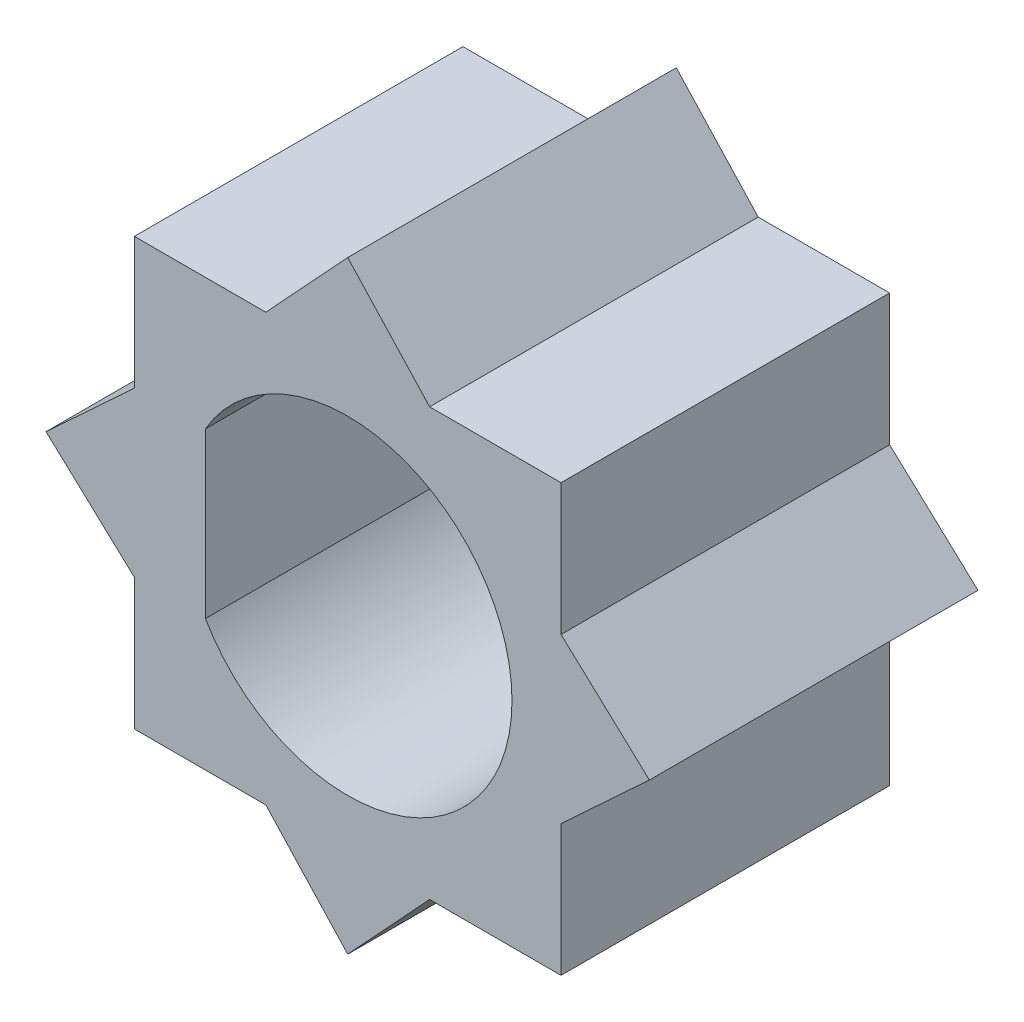
ISO-10303-21;
HEADER;
FILE_DESCRIPTION(('STEP AP214'),'2;1');
FILE_NAME('part.step','',(''),(''),'','','');
FILE_SCHEMA(('AUTOMOTIVE_DESIGN { 1 0 10303 214 1 1 1 1 }'));
ENDSEC;
DATA;
#1=APPLICATION_CONTEXT('core data for automotive mechanical design processes');
#2=APPLICATION_PROTOCOL_DEFINITION('international standard','automotive_design',2000,#1);
#3=PRODUCT_CONTEXT('',#1,'mechanical');
#4=PRODUCT('Part','Part','',(#3));
#5=PRODUCT_RELATED_PRODUCT_CATEGORY('part','',(#4));
#6=PRODUCT_DEFINITION_FORMATION('','',#4);
#7=PRODUCT_DEFINITION_CONTEXT('part definition',#1,'design');
#8=PRODUCT_DEFINITION('design','',#6,#7);
#9=PRODUCT_DEFINITION_SHAPE('','',#8);
#10=(LENGTH_UNIT() NAMED_UNIT(*) SI_UNIT(.MILLI.,.METRE.));
#11=(NAMED_UNIT(*) PLANE_ANGLE_UNIT() SI_UNIT($,.RADIAN.));
#12=(NAMED_UNIT(*) SI_UNIT($,.STERADIAN.) SOLID_ANGLE_UNIT());
#13=UNCERTAINTY_MEASURE_WITH_UNIT(LENGTH_MEASURE(1.E-05),#10,'distance_accuracy_value','');
#14=(GEOMETRIC_REPRESENTATION_CONTEXT(3) GLOBAL_UNCERTAINTY_ASSIGNED_CONTEXT((#13)) GLOBAL_UNIT_ASSIGNED_CONTEXT((#10,
#11,#12)) REPRESENTATION_CONTEXT('',''));
#15=CARTESIAN_POINT('',(0.,0.,0.));
#16=DIRECTION('',(0.,0.,1.));
#17=DIRECTION('',(1.,0.,0.));
#18=AXIS2_PLACEMENT_3D('',#15,#16,#17);
#19=CARTESIAN_POINT('',(-13.4417507259649,6.25286524946414,6.));
#20=DIRECTION('',(0.,0.,-1.));
#21=DIRECTION('',(-1.,0.,0.));
#22=AXIS2_PLACEMENT_3D('',#19,#20,#21);
#23=CYLINDRICAL_SURFACE('',#22,3.);
#24=CARTESIAN_POINT('',(-13.4417507259649,6.25286524946414,0.));
#25=DIRECTION('',(0.,0.,1.));
#26=DIRECTION('',(1.,0.,0.));
#27=AXIS2_PLACEMENT_3D('',#24,#25,#26);
#28=CIRCLE('',#27,3.);
#29=CARTESIAN_POINT('',(-16.0398269373182,4.75286524946414,0.));
#30=VERTEX_POINT('',#29);
#31=CARTESIAN_POINT('',(-16.0398269373182,7.75286524946414,0.));
#32=VERTEX_POINT('',#31);
#33=EDGE_CURVE('E189',#30,#32,#28,.T.);
#34=ORIENTED_EDGE('',*,*,#33,.F.);
#35=DIRECTION('',(0.,0.,-1.));
#36=VECTOR('',#35,1.);
#37=CARTESIAN_POINT('',(-16.0398269373182,4.75286524946414,6.));
#38=LINE('',#37,#36);
#39=CARTESIAN_POINT('',(-16.0398269373182,4.75286524946414,6.));
#40=VERTEX_POINT('',#39);
#41=EDGE_CURVE('E11',#40,#30,#38,.T.);
#42=ORIENTED_EDGE('',*,*,#41,.F.);
#43=CARTESIAN_POINT('',(-13.4417507259649,6.25286524946414,6.));
#44=DIRECTION('',(0.,0.,1.));
#45=DIRECTION('',(1.,0.,0.));
#46=AXIS2_PLACEMENT_3D('',#43,#44,#45);
#47=CIRCLE('',#46,3.);
#48=CARTESIAN_POINT('',(-16.0398269373182,7.75286524946414,6.));
#49=VERTEX_POINT('',#48);
#50=EDGE_CURVE('E172',#40,#49,#47,.T.);
#51=ORIENTED_EDGE('',*,*,#50,.T.);
#52=DIRECTION('',(0.,0.,-1.));
#53=VECTOR('',#52,1.);
#54=CARTESIAN_POINT('',(-16.0398269373182,7.75286524946414,6.));
#55=LINE('',#54,#53);
#56=EDGE_CURVE('E44',#49,#32,#55,.T.);
#57=ORIENTED_EDGE('',*,*,#56,.T.);
#58=EDGE_LOOP('',(#34,#42,#51,#57));
#59=FACE_BOUND('',#58,.T.);
#60=ADVANCED_FACE('F34',(#59),#23,.F.);
#61=CARTESIAN_POINT('',(-11.8740707010206,12.811674675176,6.));
#62=DIRECTION('',(-0.679759603640439,0.733434987751875,0.));
#63=DIRECTION('',(-0.733434987751875,-0.679759603640439,0.));
#64=AXIS2_PLACEMENT_3D('',#61,#62,#63);
#65=PLANE('',#64);
#66=DIRECTION('',(0.733434987751875,0.679759603640439,0.));
#67=VECTOR('',#66,1.);
#68=CARTESIAN_POINT('',(-11.8740707010206,12.811674675176,0.));
#69=LINE('',#68,#67);
#70=CARTESIAN_POINT('',(-18.950778827028,6.25286524946417,0.));
#71=VERTEX_POINT('',#70);
#72=CARTESIAN_POINT('',(-17.3372218539739,7.74833637747313,0.));
#73=VERTEX_POINT('',#72);
#74=EDGE_CURVE('E219',#71,#73,#69,.T.);
#75=ORIENTED_EDGE('',*,*,#74,.F.);
#76=DIRECTION('',(0.,0.,-1.));
#77=VECTOR('',#76,1.);
#78=CARTESIAN_POINT('',(-18.950778827028,6.25286524946417,6.));
#79=LINE('',#78,#77);
#80=CARTESIAN_POINT('',(-18.950778827028,6.25286524946417,6.));
#81=VERTEX_POINT('',#80);
#82=EDGE_CURVE('E38',#81,#71,#79,.T.);
#83=ORIENTED_EDGE('',*,*,#82,.F.);
#84=DIRECTION('',(0.733434987751875,0.679759603640439,0.));
#85=VECTOR('',#84,1.);
#86=CARTESIAN_POINT('',(-11.8740707010206,12.811674675176,6.));
#87=LINE('',#86,#85);
#88=CARTESIAN_POINT('',(-17.3372218539739,7.74833637747313,6.));
#89=VERTEX_POINT('',#88);
#90=EDGE_CURVE('E168',#81,#89,#87,.T.);
#91=ORIENTED_EDGE('',*,*,#90,.T.);
#92=DIRECTION('',(0.,0.,-1.));
#93=VECTOR('',#92,1.);
#94=CARTESIAN_POINT('',(-17.3372218539739,7.74833637747313,6.));
#95=LINE('',#94,#93);
#96=EDGE_CURVE('E176',#89,#73,#95,.T.);
#97=ORIENTED_EDGE('',*,*,#96,.T.);
#98=EDGE_LOOP('',(#75,#83,#91,#97));
#99=FACE_BOUND('',#98,.T.);
#100=ADVANCED_FACE('F36',(#99),#65,.T.);
#101=CARTESIAN_POINT('',(-5.63922024934631,-6.08450607002705,6.));
#102=DIRECTION('',(0.679759603640439,0.733434987751875,0.));
#103=DIRECTION('',(-0.733434987751875,0.679759603640439,0.));
#104=AXIS2_PLACEMENT_3D('',#101,#102,#103);
#105=PLANE('',#104);
#106=DIRECTION('',(0.733434987751875,-0.679759603640439,0.));
#107=VECTOR('',#106,1.);
#108=CARTESIAN_POINT('',(-5.63922024934631,-6.08450607002705,0.));
#109=LINE('',#108,#107);
#110=CARTESIAN_POINT('',(-17.3372218539739,4.7573941214552,0.));
#111=VERTEX_POINT('',#110);
#112=EDGE_CURVE('E221',#71,#111,#109,.T.);
#113=ORIENTED_EDGE('',*,*,#112,.T.);
#114=DIRECTION('',(0.,0.,-1.));
#115=VECTOR('',#114,1.);
#116=CARTESIAN_POINT('',(-17.3372218539739,4.7573941214552,6.));
#117=LINE('',#116,#115);
#118=CARTESIAN_POINT('',(-17.3372218539739,4.7573941214552,6.));
#119=VERTEX_POINT('',#118);
#120=EDGE_CURVE('E282',#119,#111,#117,.T.);
#121=ORIENTED_EDGE('',*,*,#120,.F.);
#122=DIRECTION('',(0.733434987751875,-0.679759603640439,0.));
#123=VECTOR('',#122,1.);
#124=CARTESIAN_POINT('',(-5.63922024934631,-6.08450607002705,6.));
#125=LINE('',#124,#123);
#126=EDGE_CURVE('E184',#81,#119,#125,.T.);
#127=ORIENTED_EDGE('',*,*,#126,.F.);
#128=ORIENTED_EDGE('',*,*,#82,.T.);
#129=EDGE_LOOP('',(#113,#121,#127,#128));
#130=FACE_BOUND('',#129,.T.);
#131=ADVANCED_FACE('F290',(#130),#105,.F.);
#132=CARTESIAN_POINT('',(-17.3372218539739,0.,6.));
#133=DIRECTION('',(1.,0.,0.));
#134=DIRECTION('',(0.,0.,-1.));
#135=AXIS2_PLACEMENT_3D('',#132,#133,#134);
#136=PLANE('',#135);
#137=DIRECTION('',(0.,-1.,0.));
#138=VECTOR('',#137,1.);
#139=CARTESIAN_POINT('',(-17.3372218539739,0.,0.));
#140=LINE('',#139,#138);
#141=CARTESIAN_POINT('',(-17.3372218539739,2.35739412145516,0.));
#142=VERTEX_POINT('',#141);
#143=EDGE_CURVE('E223',#111,#142,#140,.T.);
#144=ORIENTED_EDGE('',*,*,#143,.T.);
#145=DIRECTION('',(0.,0.,-1.));
#146=VECTOR('',#145,1.);
#147=CARTESIAN_POINT('',(-17.3372218539739,2.35739412145516,6.));
#148=LINE('',#147,#146);
#149=CARTESIAN_POINT('',(-17.3372218539739,2.35739412145516,6.));
#150=VERTEX_POINT('',#149);
#151=EDGE_CURVE('E280',#150,#142,#148,.T.);
#152=ORIENTED_EDGE('',*,*,#151,.F.);
#153=DIRECTION('',(0.,-1.,0.));
#154=VECTOR('',#153,1.);
#155=CARTESIAN_POINT('',(-17.3372218539739,0.,6.));
#156=LINE('',#155,#154);
#157=EDGE_CURVE('E174',#119,#150,#156,.T.);
#158=ORIENTED_EDGE('',*,*,#157,.F.);
#159=ORIENTED_EDGE('',*,*,#120,.T.);
#160=EDGE_LOOP('',(#144,#152,#158,#159));
#161=FACE_BOUND('',#160,.T.);
#162=ADVANCED_FACE('F296',(#161),#136,.F.);
#163=CARTESIAN_POINT('',(0.,2.35739412145516,6.));
#164=DIRECTION('',(0.,1.,0.));
#165=DIRECTION('',(0.,0.,1.));
#166=AXIS2_PLACEMENT_3D('',#163,#164,#165);
#167=PLANE('',#166);
#168=DIRECTION('',(1.,0.,0.));
#169=VECTOR('',#168,1.);
#170=CARTESIAN_POINT('',(0.,2.35739412145516,0.));
#171=LINE('',#170,#169);
#172=CARTESIAN_POINT('',(-14.9372218539739,2.35739412145516,0.));
#173=VERTEX_POINT('',#172);
#174=EDGE_CURVE('E225',#142,#173,#171,.T.);
#175=ORIENTED_EDGE('',*,*,#174,.T.);
#176=DIRECTION('',(0.,0.,-1.));
#177=VECTOR('',#176,1.);
#178=CARTESIAN_POINT('',(-14.9372218539739,2.35739412145516,6.));
#179=LINE('',#178,#177);
#180=CARTESIAN_POINT('',(-14.9372218539739,2.35739412145516,6.));
#181=VERTEX_POINT('',#180);
#182=EDGE_CURVE('E278',#181,#173,#179,.T.);
#183=ORIENTED_EDGE('',*,*,#182,.F.);
#184=DIRECTION('',(1.,0.,0.));
#185=VECTOR('',#184,1.);
#186=CARTESIAN_POINT('',(0.,2.35739412145516,6.));
#187=LINE('',#186,#185);
#188=EDGE_CURVE('E192',#150,#181,#187,.T.);
#189=ORIENTED_EDGE('',*,*,#188,.F.);
#190=ORIENTED_EDGE('',*,*,#151,.T.);
#191=EDGE_LOOP('',(#175,#183,#189,#190));
#192=FACE_BOUND('',#191,.T.);
#193=ADVANCED_FACE('F299',(#192),#167,.F.);
#194=CARTESIAN_POINT('',(-6.85983198731295,-6.35780505512735,6.));
#195=DIRECTION('',(-0.733434987751855,-0.679759603640461,0.));
#196=DIRECTION('',(0.679759603640461,-0.733434987751855,0.));
#197=AXIS2_PLACEMENT_3D('',#194,#195,#196);
#198=PLANE('',#197);
#199=DIRECTION('',(-0.679759603640461,0.733434987751855,0.));
#200=VECTOR('',#199,1.);
#201=CARTESIAN_POINT('',(-6.85983198731295,-6.35780505512735,0.));
#202=LINE('',#201,#200);
#203=CARTESIAN_POINT('',(-13.4417507259648,0.743837148401012,0.));
#204=VERTEX_POINT('',#203);
#205=EDGE_CURVE('E228',#204,#173,#202,.T.);
#206=ORIENTED_EDGE('',*,*,#205,.F.);
#207=DIRECTION('',(0.,0.,-1.));
#208=VECTOR('',#207,1.);
#209=CARTESIAN_POINT('',(-13.4417507259648,0.743837148401012,6.));
#210=LINE('',#209,#208);
#211=CARTESIAN_POINT('',(-13.4417507259648,0.743837148401012,6.));
#212=VERTEX_POINT('',#211);
#213=EDGE_CURVE('E276',#212,#204,#210,.T.);
#214=ORIENTED_EDGE('',*,*,#213,.F.);
#215=DIRECTION('',(-0.679759603640461,0.733434987751855,0.));
#216=VECTOR('',#215,1.);
#217=CARTESIAN_POINT('',(-6.85983198731295,-6.35780505512735,6.));
#218=LINE('',#217,#216);
#219=EDGE_CURVE('E194',#212,#181,#218,.T.);
#220=ORIENTED_EDGE('',*,*,#219,.T.);
#221=ORIENTED_EDGE('',*,*,#182,.T.);
#222=EDGE_LOOP('',(#206,#214,#220,#221));
#223=FACE_BOUND('',#222,.T.);
#224=ADVANCED_FACE('F306',(#223),#198,.T.);
#225=CARTESIAN_POINT('',(-7.60152610603424,7.04521935712204,6.));
#226=DIRECTION('',(-0.733434987751889,0.679759603640424,0.));
#227=DIRECTION('',(-0.679759603640424,-0.733434987751889,0.));
#228=AXIS2_PLACEMENT_3D('',#225,#226,#227);
#229=PLANE('',#228);
#230=DIRECTION('',(0.679759603640424,0.733434987751889,0.));
#231=VECTOR('',#230,1.);
#232=CARTESIAN_POINT('',(-7.60152610603424,7.04521935712204,0.));
#233=LINE('',#232,#231);
#234=CARTESIAN_POINT('',(-11.9462795979558,2.35739412145516,0.));
#235=VERTEX_POINT('',#234);
#236=EDGE_CURVE('E232',#204,#235,#233,.T.);
#237=ORIENTED_EDGE('',*,*,#236,.T.);
#238=DIRECTION('',(0.,0.,-1.));
#239=VECTOR('',#238,1.);
#240=CARTESIAN_POINT('',(-11.9462795979558,2.35739412145516,6.));
#241=LINE('',#240,#239);
#242=CARTESIAN_POINT('',(-11.9462795979558,2.35739412145516,6.));
#243=VERTEX_POINT('',#242);
#244=EDGE_CURVE('E273',#243,#235,#241,.T.);
#245=ORIENTED_EDGE('',*,*,#244,.F.);
#246=DIRECTION('',(0.679759603640424,0.733434987751889,0.));
#247=VECTOR('',#246,1.);
#248=CARTESIAN_POINT('',(-7.60152610603424,7.04521935712204,6.));
#249=LINE('',#248,#247);
#250=EDGE_CURVE('E198',#212,#243,#249,.T.);
#251=ORIENTED_EDGE('',*,*,#250,.F.);
#252=ORIENTED_EDGE('',*,*,#213,.T.);
#253=EDGE_LOOP('',(#237,#245,#251,#252));
#254=FACE_BOUND('',#253,.T.);
#255=ADVANCED_FACE('F309',(#254),#229,.F.);
#256=CARTESIAN_POINT('',(-9.54627959795585,2.35739412145516,0.));
#257=VERTEX_POINT('',#256);
#258=EDGE_CURVE('E229',#235,#257,#171,.T.);
#259=ORIENTED_EDGE('',*,*,#258,.T.);
#260=DIRECTION('',(0.,0.,-1.));
#261=VECTOR('',#260,1.);
#262=CARTESIAN_POINT('',(-9.54627959795585,2.35739412145516,6.));
#263=LINE('',#262,#261);
#264=CARTESIAN_POINT('',(-9.54627959795585,2.35739412145516,6.));
#265=VERTEX_POINT('',#264);
#266=EDGE_CURVE('E271',#265,#257,#263,.T.);
#267=ORIENTED_EDGE('',*,*,#266,.F.);
#268=EDGE_CURVE('E195',#243,#265,#187,.T.);
#269=ORIENTED_EDGE('',*,*,#268,.F.);
#270=ORIENTED_EDGE('',*,*,#244,.T.);
#271=EDGE_LOOP('',(#259,#267,#269,#270));
#272=FACE_BOUND('',#271,.T.);
#273=ADVANCED_FACE('F315',(#272),#167,.F.);
#274=CARTESIAN_POINT('',(-9.54627959795585,0.,6.));
#275=DIRECTION('',(1.,0.,0.));
#276=DIRECTION('',(0.,0.,-1.));
#277=AXIS2_PLACEMENT_3D('',#274,#275,#276);
#278=PLANE('',#277);
#279=DIRECTION('',(0.,-1.,0.));
#280=VECTOR('',#279,1.);
#281=CARTESIAN_POINT('',(-9.54627959795585,0.,0.));
#282=LINE('',#281,#280);
#283=CARTESIAN_POINT('',(-9.54627959795585,4.75739412145515,0.));
#284=VERTEX_POINT('',#283);
#285=EDGE_CURVE('E234',#284,#257,#282,.T.);
#286=ORIENTED_EDGE('',*,*,#285,.F.);
#287=DIRECTION('',(0.,0.,-1.));
#288=VECTOR('',#287,1.);
#289=CARTESIAN_POINT('',(-9.54627959795585,4.75739412145515,6.));
#290=LINE('',#289,#288);
#291=CARTESIAN_POINT('',(-9.54627959795585,4.75739412145515,6.));
#292=VERTEX_POINT('',#291);
#293=EDGE_CURVE('E269',#292,#284,#290,.T.);
#294=ORIENTED_EDGE('',*,*,#293,.F.);
#295=DIRECTION('',(0.,-1.,0.));
#296=VECTOR('',#295,1.);
#297=CARTESIAN_POINT('',(-9.54627959795585,0.,6.));
#298=LINE('',#297,#296);
#299=EDGE_CURVE('E200',#292,#265,#298,.T.);
#300=ORIENTED_EDGE('',*,*,#299,.T.);
#301=ORIENTED_EDGE('',*,*,#266,.T.);
#302=EDGE_LOOP('',(#286,#294,#300,#301));
#303=FACE_BOUND('',#302,.T.);
#304=ADVANCED_FACE('F322',(#303),#278,.T.);
#305=CARTESIAN_POINT('',(-6.78292310923605,7.31851834222237,6.));
#306=DIRECTION('',(-0.679759603640446,0.733434987751869,0.));
#307=DIRECTION('',(-0.733434987751869,-0.679759603640446,0.));
#308=AXIS2_PLACEMENT_3D('',#305,#306,#307);
#309=PLANE('',#308);
#310=DIRECTION('',(0.733434987751869,0.679759603640446,0.));
#311=VECTOR('',#310,1.);
#312=CARTESIAN_POINT('',(-6.78292310923605,7.31851834222237,0.));
#313=LINE('',#312,#311);
#314=CARTESIAN_POINT('',(-7.93272262490172,6.25286524946414,0.));
#315=VERTEX_POINT('',#314);
#316=EDGE_CURVE('E237',#284,#315,#313,.T.);
#317=ORIENTED_EDGE('',*,*,#316,.T.);
#318=DIRECTION('',(0.,0.,-1.));
#319=VECTOR('',#318,1.);
#320=CARTESIAN_POINT('',(-7.93272262490172,6.25286524946414,6.));
#321=LINE('',#320,#319);
#322=CARTESIAN_POINT('',(-7.93272262490172,6.25286524946414,6.));
#323=VERTEX_POINT('',#322);
#324=EDGE_CURVE('E267',#323,#315,#321,.T.);
#325=ORIENTED_EDGE('',*,*,#324,.F.);
#326=DIRECTION('',(0.733434987751869,0.679759603640446,0.));
#327=VECTOR('',#326,1.);
#328=CARTESIAN_POINT('',(-6.78292310923605,7.31851834222237,6.));
#329=LINE('',#328,#327);
#330=EDGE_CURVE('E203',#292,#323,#329,.T.);
#331=ORIENTED_EDGE('',*,*,#330,.F.);
#332=ORIENTED_EDGE('',*,*,#293,.T.);
#333=EDGE_LOOP('',(#317,#325,#331,#332));
#334=FACE_BOUND('',#333,.T.);
#335=ADVANCED_FACE('F325',(#334),#309,.F.);
#336=CARTESIAN_POINT('',(-0.548072657561674,-0.591349737073399,6.));
#337=DIRECTION('',(0.679759603640432,0.733434987751882,0.));
#338=DIRECTION('',(-0.733434987751882,0.679759603640432,0.));
#339=AXIS2_PLACEMENT_3D('',#336,#337,#338);
#340=PLANE('',#339);
#341=DIRECTION('',(0.733434987751881,-0.679759603640432,0.));
#342=VECTOR('',#341,1.);
#343=CARTESIAN_POINT('',(-0.548072657561674,-0.591349737073399,0.));
#344=LINE('',#343,#342);
#345=CARTESIAN_POINT('',(-9.54627959795585,7.74833637747307,0.));
#346=VERTEX_POINT('',#345);
#347=EDGE_CURVE('E241',#346,#315,#344,.T.);
#348=ORIENTED_EDGE('',*,*,#347,.F.);
#349=DIRECTION('',(0.,0.,-1.));
#350=VECTOR('',#349,1.);
#351=CARTESIAN_POINT('',(-9.54627959795585,7.74833637747307,6.));
#352=LINE('',#351,#350);
#353=CARTESIAN_POINT('',(-9.54627959795585,7.74833637747307,6.));
#354=VERTEX_POINT('',#353);
#355=EDGE_CURVE('E265',#354,#346,#352,.T.);
#356=ORIENTED_EDGE('',*,*,#355,.F.);
#357=DIRECTION('',(0.733434987751881,-0.679759603640432,0.));
#358=VECTOR('',#357,1.);
#359=CARTESIAN_POINT('',(-0.548072657561674,-0.591349737073399,6.));
#360=LINE('',#359,#358);
#361=EDGE_CURVE('E206',#354,#323,#360,.T.);
#362=ORIENTED_EDGE('',*,*,#361,.T.);
#363=ORIENTED_EDGE('',*,*,#324,.T.);
#364=EDGE_LOOP('',(#348,#356,#362,#363));
#365=FACE_BOUND('',#364,.T.);
#366=ADVANCED_FACE('F328',(#365),#340,.T.);
#367=CARTESIAN_POINT('',(-9.54627959795585,10.1483363774731,0.));
#368=VERTEX_POINT('',#367);
#369=EDGE_CURVE('E238',#368,#346,#282,.T.);
#370=ORIENTED_EDGE('',*,*,#369,.F.);
#371=DIRECTION('',(0.,0.,-1.));
#372=VECTOR('',#371,1.);
#373=CARTESIAN_POINT('',(-9.54627959795585,10.1483363774731,6.));
#374=LINE('',#373,#372);
#375=CARTESIAN_POINT('',(-9.54627959795585,10.1483363774731,6.));
#376=VERTEX_POINT('',#375);
#377=EDGE_CURVE('E263',#376,#368,#374,.T.);
#378=ORIENTED_EDGE('',*,*,#377,.F.);
#379=EDGE_CURVE('E204',#376,#354,#298,.T.);
#380=ORIENTED_EDGE('',*,*,#379,.T.);
#381=ORIENTED_EDGE('',*,*,#355,.T.);
#382=EDGE_LOOP('',(#370,#378,#380,#381));
#383=FACE_BOUND('',#382,.T.);
#384=ADVANCED_FACE('F334',(#383),#278,.T.);
#385=CARTESIAN_POINT('',(0.,10.1483363774731,6.));
#386=DIRECTION('',(0.,1.,0.));
#387=DIRECTION('',(0.,0.,1.));
#388=AXIS2_PLACEMENT_3D('',#385,#386,#387);
#389=PLANE('',#388);
#390=DIRECTION('',(1.,0.,0.));
#391=VECTOR('',#390,1.);
#392=CARTESIAN_POINT('',(0.,10.1483363774731,0.));
#393=LINE('',#392,#391);
#394=CARTESIAN_POINT('',(-11.9462795979558,10.1483363774731,0.));
#395=VERTEX_POINT('',#394);
#396=EDGE_CURVE('E244',#395,#368,#393,.T.);
#397=ORIENTED_EDGE('',*,*,#396,.F.);
#398=DIRECTION('',(0.,0.,-1.));
#399=VECTOR('',#398,1.);
#400=CARTESIAN_POINT('',(-11.9462795979558,10.1483363774731,6.));
#401=LINE('',#400,#399);
#402=CARTESIAN_POINT('',(-11.9462795979558,10.1483363774731,6.));
#403=VERTEX_POINT('',#402);
#404=EDGE_CURVE('E261',#403,#395,#401,.T.);
#405=ORIENTED_EDGE('',*,*,#404,.F.);
#406=DIRECTION('',(1.,0.,0.));
#407=VECTOR('',#406,1.);
#408=CARTESIAN_POINT('',(0.,10.1483363774731,6.));
#409=LINE('',#408,#407);
#410=EDGE_CURVE('E209',#403,#376,#409,.T.);
#411=ORIENTED_EDGE('',*,*,#410,.T.);
#412=ORIENTED_EDGE('',*,*,#377,.T.);
#413=EDGE_LOOP('',(#397,#405,#411,#412));
#414=FACE_BOUND('',#413,.T.);
#415=ADVANCED_FACE('F338',(#414),#389,.T.);
#416=CARTESIAN_POINT('',(-1.36667565435981,-1.26665746334282,6.));
#417=DIRECTION('',(0.733434987751876,0.679759603640438,0.));
#418=DIRECTION('',(-0.679759603640438,0.733434987751877,0.));
#419=AXIS2_PLACEMENT_3D('',#416,#417,#418);
#420=PLANE('',#419);
#421=DIRECTION('',(0.679759603640438,-0.733434987751877,0.));
#422=VECTOR('',#421,1.);
#423=CARTESIAN_POINT('',(-1.36667565435981,-1.26665746334282,0.));
#424=LINE('',#423,#422);
#425=CARTESIAN_POINT('',(-13.4417507259648,11.7618933505273,0.));
#426=VERTEX_POINT('',#425);
#427=EDGE_CURVE('E247',#426,#395,#424,.T.);
#428=ORIENTED_EDGE('',*,*,#427,.F.);
#429=DIRECTION('',(0.,0.,-1.));
#430=VECTOR('',#429,1.);
#431=CARTESIAN_POINT('',(-13.4417507259648,11.7618933505273,6.));
#432=LINE('',#431,#430);
#433=CARTESIAN_POINT('',(-13.4417507259648,11.7618933505273,6.));
#434=VERTEX_POINT('',#433);
#435=EDGE_CURVE('E259',#434,#426,#432,.T.);
#436=ORIENTED_EDGE('',*,*,#435,.F.);
#437=DIRECTION('',(0.679759603640438,-0.733434987751877,0.));
#438=VECTOR('',#437,1.);
#439=CARTESIAN_POINT('',(-1.36667565435981,-1.26665746334282,6.));
#440=LINE('',#439,#438);
#441=EDGE_CURVE('E212',#434,#403,#440,.T.);
#442=ORIENTED_EDGE('',*,*,#441,.T.);
#443=ORIENTED_EDGE('',*,*,#404,.T.);
#444=EDGE_LOOP('',(#428,#436,#442,#443));
#445=FACE_BOUND('',#444,.T.);
#446=ADVANCED_FACE('F342',(#445),#420,.T.);
#447=CARTESIAN_POINT('',(-13.0946824389881,12.1363669489062,6.));
#448=DIRECTION('',(0.733434987751901,-0.679759603640411,0.));
#449=DIRECTION('',(0.679759603640411,0.733434987751901,0.));
#450=AXIS2_PLACEMENT_3D('',#447,#448,#449);
#451=PLANE('',#450);
#452=DIRECTION('',(-0.679759603640411,-0.733434987751901,0.));
#453=VECTOR('',#452,1.);
#454=CARTESIAN_POINT('',(-13.0946824389881,12.1363669489062,0.));
#455=LINE('',#454,#453);
#456=CARTESIAN_POINT('',(-14.9372218539738,10.1483363774731,0.));
#457=VERTEX_POINT('',#456);
#458=EDGE_CURVE('E251',#426,#457,#455,.T.);
#459=ORIENTED_EDGE('',*,*,#458,.T.);
#460=DIRECTION('',(0.,0.,-1.));
#461=VECTOR('',#460,1.);
#462=CARTESIAN_POINT('',(-14.9372218539738,10.1483363774731,6.));
#463=LINE('',#462,#461);
#464=CARTESIAN_POINT('',(-14.9372218539738,10.1483363774731,6.));
#465=VERTEX_POINT('',#464);
#466=EDGE_CURVE('E257',#465,#457,#463,.T.);
#467=ORIENTED_EDGE('',*,*,#466,.F.);
#468=DIRECTION('',(-0.679759603640411,-0.733434987751901,0.));
#469=VECTOR('',#468,1.);
#470=CARTESIAN_POINT('',(-13.0946824389881,12.1363669489062,6.));
#471=LINE('',#470,#469);
#472=EDGE_CURVE('E215',#434,#465,#471,.T.);
#473=ORIENTED_EDGE('',*,*,#472,.F.);
#474=ORIENTED_EDGE('',*,*,#435,.T.);
#475=EDGE_LOOP('',(#459,#467,#473,#474));
#476=FACE_BOUND('',#475,.T.);
#477=ADVANCED_FACE('F347',(#476),#451,.F.);
#478=CARTESIAN_POINT('',(-17.3372218539739,10.1483363774731,0.));
#479=VERTEX_POINT('',#478);
#480=EDGE_CURVE('E248',#479,#457,#393,.T.);
#481=ORIENTED_EDGE('',*,*,#480,.F.);
#482=DIRECTION('',(0.,0.,-1.));
#483=VECTOR('',#482,1.);
#484=CARTESIAN_POINT('',(-17.3372218539739,10.1483363774731,6.));
#485=LINE('',#484,#483);
#486=CARTESIAN_POINT('',(-17.3372218539739,10.1483363774731,6.));
#487=VERTEX_POINT('',#486);
#488=EDGE_CURVE('E181',#487,#479,#485,.T.);
#489=ORIENTED_EDGE('',*,*,#488,.F.);
#490=EDGE_CURVE('E170',#487,#465,#409,.T.);
#491=ORIENTED_EDGE('',*,*,#490,.T.);
#492=ORIENTED_EDGE('',*,*,#466,.T.);
#493=EDGE_LOOP('',(#481,#489,#491,#492));
#494=FACE_BOUND('',#493,.T.);
#495=ADVANCED_FACE('F351',(#494),#389,.T.);
#496=EDGE_CURVE('E179',#479,#73,#140,.T.);
#497=ORIENTED_EDGE('',*,*,#496,.T.);
#498=ORIENTED_EDGE('',*,*,#96,.F.);
#499=EDGE_CURVE('E164',#487,#89,#156,.T.);
#500=ORIENTED_EDGE('',*,*,#499,.F.);
#501=ORIENTED_EDGE('',*,*,#488,.T.);
#502=EDGE_LOOP('',(#497,#498,#500,#501));
#503=FACE_BOUND('',#502,.T.);
#504=ADVANCED_FACE('F177',(#503),#136,.F.);
#505=CARTESIAN_POINT('',(-16.0398269373182,0.,6.));
#506=DIRECTION('',(1.,0.,0.));
#507=DIRECTION('',(0.,0.,-1.));
#508=AXIS2_PLACEMENT_3D('',#505,#506,#507);
#509=PLANE('',#508);
#510=DIRECTION('',(0.,-1.,0.));
#511=VECTOR('',#510,1.);
#512=CARTESIAN_POINT('',(-16.0398269373182,0.,0.));
#513=LINE('',#512,#511);
#514=EDGE_CURVE('E185',#32,#30,#513,.T.);
#515=ORIENTED_EDGE('',*,*,#514,.F.);
#516=ORIENTED_EDGE('',*,*,#56,.F.);
#517=DIRECTION('',(0.,-1.,0.));
#518=VECTOR('',#517,1.);
#519=CARTESIAN_POINT('',(-16.0398269373182,0.,6.));
#520=LINE('',#519,#518);
#521=EDGE_CURVE('E182',#49,#40,#520,.T.);
#522=ORIENTED_EDGE('',*,*,#521,.T.);
#523=ORIENTED_EDGE('',*,*,#41,.T.);
#524=EDGE_LOOP('',(#515,#516,#522,#523));
#525=FACE_BOUND('',#524,.T.);
#526=ADVANCED_FACE('F358',(#525),#509,.T.);
#527=CARTESIAN_POINT('',(0.,0.,6.));
#528=DIRECTION('',(0.,0.,1.));
#529=DIRECTION('',(1.,0.,0.));
#530=AXIS2_PLACEMENT_3D('',#527,#528,#529);
#531=PLANE('',#530);
#532=ORIENTED_EDGE('',*,*,#90,.F.);
#533=ORIENTED_EDGE('',*,*,#126,.T.);
#534=ORIENTED_EDGE('',*,*,#157,.T.);
#535=ORIENTED_EDGE('',*,*,#188,.T.);
#536=ORIENTED_EDGE('',*,*,#219,.F.);
#537=ORIENTED_EDGE('',*,*,#250,.T.);
#538=ORIENTED_EDGE('',*,*,#268,.T.);
#539=ORIENTED_EDGE('',*,*,#299,.F.);
#540=ORIENTED_EDGE('',*,*,#330,.T.);
#541=ORIENTED_EDGE('',*,*,#361,.F.);
#542=ORIENTED_EDGE('',*,*,#379,.F.);
#543=ORIENTED_EDGE('',*,*,#410,.F.);
#544=ORIENTED_EDGE('',*,*,#441,.F.);
#545=ORIENTED_EDGE('',*,*,#472,.T.);
#546=ORIENTED_EDGE('',*,*,#490,.F.);
#547=ORIENTED_EDGE('',*,*,#499,.T.);
#548=EDGE_LOOP('',(#532,#533,#534,#535,#536,#537,#538,#539,#540,#541,#542,#543,#544,#545,#546,#547));
#549=FACE_BOUND('',#548,.T.);
#550=ORIENTED_EDGE('',*,*,#50,.F.);
#551=ORIENTED_EDGE('',*,*,#521,.F.);
#552=EDGE_LOOP('',(#550,#551));
#553=FACE_BOUND('',#552,.T.);
#554=ADVANCED_FACE('F166',(#549,#553),#531,.T.);
#555=CARTESIAN_POINT('',(0.,0.,0.));
#556=DIRECTION('',(0.,0.,1.));
#557=DIRECTION('',(1.,0.,0.));
#558=AXIS2_PLACEMENT_3D('',#555,#556,#557);
#559=PLANE('',#558);
#560=ORIENTED_EDGE('',*,*,#74,.T.);
#561=ORIENTED_EDGE('',*,*,#496,.F.);
#562=ORIENTED_EDGE('',*,*,#480,.T.);
#563=ORIENTED_EDGE('',*,*,#458,.F.);
#564=ORIENTED_EDGE('',*,*,#427,.T.);
#565=ORIENTED_EDGE('',*,*,#396,.T.);
#566=ORIENTED_EDGE('',*,*,#369,.T.);
#567=ORIENTED_EDGE('',*,*,#347,.T.);
#568=ORIENTED_EDGE('',*,*,#316,.F.);
#569=ORIENTED_EDGE('',*,*,#285,.T.);
#570=ORIENTED_EDGE('',*,*,#258,.F.);
#571=ORIENTED_EDGE('',*,*,#236,.F.);
#572=ORIENTED_EDGE('',*,*,#205,.T.);
#573=ORIENTED_EDGE('',*,*,#174,.F.);
#574=ORIENTED_EDGE('',*,*,#143,.F.);
#575=ORIENTED_EDGE('',*,*,#112,.F.);
#576=EDGE_LOOP('',(#560,#561,#562,#563,#564,#565,#566,#567,#568,#569,#570,#571,#572,#573,#574,#575));
#577=FACE_BOUND('',#576,.T.);
#578=ORIENTED_EDGE('',*,*,#33,.T.);
#579=ORIENTED_EDGE('',*,*,#514,.T.);
#580=EDGE_LOOP('',(#578,#579));
#581=FACE_BOUND('',#580,.T.);
#582=ADVANCED_FACE('F292',(#577,#581),#559,.F.);
#583=CLOSED_SHELL('',(#60,#100,#131,#162,#193,#224,#255,#273,#304,#335,#366,#384,#415,#446,#477,
#495,#504,#526,#554,#582));
#584=MANIFOLD_SOLID_BREP('B2',#583);
#585=ADVANCED_BREP_SHAPE_REPRESENTATION('',(#18,#584),#14);
#586=SHAPE_DEFINITION_REPRESENTATION(#9,#585);
ENDSEC;
END-ISO-10303-21;
